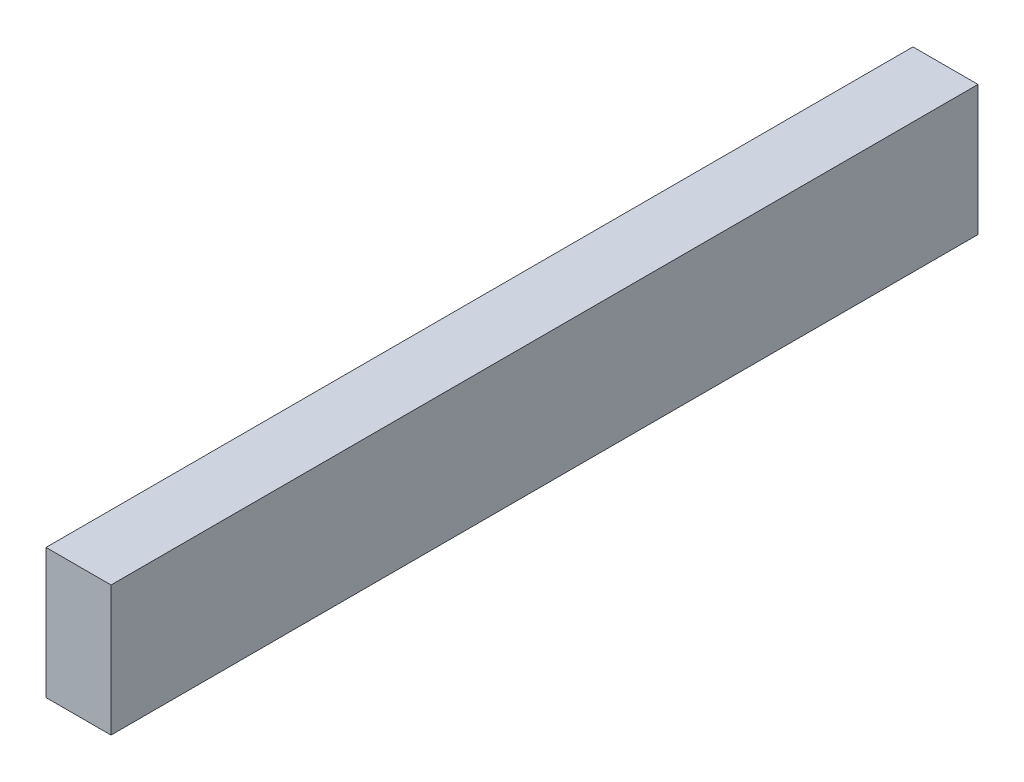
ISO-10303-21;
HEADER;
FILE_DESCRIPTION(('STEP AP214'),'2;1');
FILE_NAME('part.step','',(''),(''),'','','');
FILE_SCHEMA(('AUTOMOTIVE_DESIGN { 1 0 10303 214 1 1 1 1 }'));
ENDSEC;
DATA;
#1=APPLICATION_CONTEXT('core data for automotive mechanical design processes');
#2=APPLICATION_PROTOCOL_DEFINITION('international standard','automotive_design',2000,#1);
#3=PRODUCT_CONTEXT('',#1,'mechanical');
#4=PRODUCT('Part','Part','',(#3));
#5=PRODUCT_RELATED_PRODUCT_CATEGORY('part','',(#4));
#6=PRODUCT_DEFINITION_FORMATION('','',#4);
#7=PRODUCT_DEFINITION_CONTEXT('part definition',#1,'design');
#8=PRODUCT_DEFINITION('design','',#6,#7);
#9=PRODUCT_DEFINITION_SHAPE('','',#8);
#10=(LENGTH_UNIT() NAMED_UNIT(*) SI_UNIT(.MILLI.,.METRE.));
#11=(NAMED_UNIT(*) PLANE_ANGLE_UNIT() SI_UNIT($,.RADIAN.));
#12=(NAMED_UNIT(*) SI_UNIT($,.STERADIAN.) SOLID_ANGLE_UNIT());
#13=UNCERTAINTY_MEASURE_WITH_UNIT(LENGTH_MEASURE(1.E-05),#10,'distance_accuracy_value','');
#14=(GEOMETRIC_REPRESENTATION_CONTEXT(3) GLOBAL_UNCERTAINTY_ASSIGNED_CONTEXT((#13)) GLOBAL_UNIT_ASSIGNED_CONTEXT((#10,
#11,#12)) REPRESENTATION_CONTEXT('',''));
#15=CARTESIAN_POINT('',(0.,0.,0.));
#16=DIRECTION('',(0.,0.,1.));
#17=DIRECTION('',(1.,0.,0.));
#18=AXIS2_PLACEMENT_3D('',#15,#16,#17);
#19=CARTESIAN_POINT('',(-15.,15.,-400.));
#20=DIRECTION('',(-1.,0.,0.));
#21=DIRECTION('',(0.,0.,1.));
#22=AXIS2_PLACEMENT_3D('',#19,#20,#21);
#23=PLANE('',#22);
#24=DIRECTION('',(0.,-1.,0.));
#25=VECTOR('',#24,1.);
#26=CARTESIAN_POINT('',(-15.,15.,0.));
#27=LINE('',#26,#25);
#28=CARTESIAN_POINT('',(-15.,45.,0.));
#29=VERTEX_POINT('',#28);
#30=CARTESIAN_POINT('',(-15.,-15.,0.));
#31=VERTEX_POINT('',#30);
#32=EDGE_CURVE('E79',#29,#31,#27,.T.);
#33=ORIENTED_EDGE('',*,*,#32,.F.);
#34=DIRECTION('',(0.,0.,1.));
#35=VECTOR('',#34,1.);
#36=CARTESIAN_POINT('',(-15.,45.,-400.));
#37=LINE('',#36,#35);
#38=CARTESIAN_POINT('',(-15.,45.,-400.));
#39=VERTEX_POINT('',#38);
#40=EDGE_CURVE('E82',#39,#29,#37,.T.);
#41=ORIENTED_EDGE('',*,*,#40,.F.);
#42=DIRECTION('',(0.,-1.,0.));
#43=VECTOR('',#42,1.);
#44=CARTESIAN_POINT('',(-15.,15.,-400.));
#45=LINE('',#44,#43);
#46=CARTESIAN_POINT('',(-15.,-15.,-400.));
#47=VERTEX_POINT('',#46);
#48=EDGE_CURVE('E70',#39,#47,#45,.T.);
#49=ORIENTED_EDGE('',*,*,#48,.T.);
#50=DIRECTION('',(0.,0.,1.));
#51=VECTOR('',#50,1.);
#52=CARTESIAN_POINT('',(-15.,-15.,-400.));
#53=LINE('',#52,#51);
#54=EDGE_CURVE('E41',#47,#31,#53,.T.);
#55=ORIENTED_EDGE('',*,*,#54,.T.);
#56=EDGE_LOOP('',(#33,#41,#49,#55));
#57=FACE_BOUND('',#56,.T.);
#58=ADVANCED_FACE('F38',(#57),#23,.T.);
#59=CARTESIAN_POINT('',(15.,15.,-400.));
#60=DIRECTION('',(1.,0.,0.));
#61=DIRECTION('',(0.,1.,0.));
#62=AXIS2_PLACEMENT_3D('',#59,#60,#61);
#63=PLANE('',#62);
#64=DIRECTION('',(0.,1.,0.));
#65=VECTOR('',#64,1.);
#66=CARTESIAN_POINT('',(15.,15.,0.));
#67=LINE('',#66,#65);
#68=CARTESIAN_POINT('',(15.,-15.,0.));
#69=VERTEX_POINT('',#68);
#70=CARTESIAN_POINT('',(15.,45.,0.));
#71=VERTEX_POINT('',#70);
#72=EDGE_CURVE('E90',#69,#71,#67,.T.);
#73=ORIENTED_EDGE('',*,*,#72,.F.);
#74=DIRECTION('',(0.,0.,1.));
#75=VECTOR('',#74,1.);
#76=CARTESIAN_POINT('',(15.,-15.,-400.));
#77=LINE('',#76,#75);
#78=CARTESIAN_POINT('',(15.,-15.,-400.));
#79=VERTEX_POINT('',#78);
#80=EDGE_CURVE('E11',#79,#69,#77,.T.);
#81=ORIENTED_EDGE('',*,*,#80,.F.);
#82=DIRECTION('',(0.,1.,0.));
#83=VECTOR('',#82,1.);
#84=CARTESIAN_POINT('',(15.,15.,-400.));
#85=LINE('',#84,#83);
#86=CARTESIAN_POINT('',(15.,45.,-400.));
#87=VERTEX_POINT('',#86);
#88=EDGE_CURVE('E106',#79,#87,#85,.T.);
#89=ORIENTED_EDGE('',*,*,#88,.T.);
#90=DIRECTION('',(0.,0.,1.));
#91=VECTOR('',#90,1.);
#92=CARTESIAN_POINT('',(15.,45.,-400.));
#93=LINE('',#92,#91);
#94=EDGE_CURVE('E97',#87,#71,#93,.T.);
#95=ORIENTED_EDGE('',*,*,#94,.T.);
#96=EDGE_LOOP('',(#73,#81,#89,#95));
#97=FACE_BOUND('',#96,.T.);
#98=ADVANCED_FACE('F111',(#97),#63,.T.);
#99=CARTESIAN_POINT('',(15.,-15.,-400.));
#100=DIRECTION('',(0.,-1.,0.));
#101=DIRECTION('',(0.,0.,-1.));
#102=AXIS2_PLACEMENT_3D('',#99,#100,#101);
#103=PLANE('',#102);
#104=DIRECTION('',(1.,0.,0.));
#105=VECTOR('',#104,1.);
#106=CARTESIAN_POINT('',(15.,-15.,0.));
#107=LINE('',#106,#105);
#108=EDGE_CURVE('E85',#31,#69,#107,.T.);
#109=ORIENTED_EDGE('',*,*,#108,.F.);
#110=ORIENTED_EDGE('',*,*,#54,.F.);
#111=DIRECTION('',(1.,0.,0.));
#112=VECTOR('',#111,1.);
#113=CARTESIAN_POINT('',(15.,-15.,-400.));
#114=LINE('',#113,#112);
#115=EDGE_CURVE('E103',#47,#79,#114,.T.);
#116=ORIENTED_EDGE('',*,*,#115,.T.);
#117=ORIENTED_EDGE('',*,*,#80,.T.);
#118=EDGE_LOOP('',(#109,#110,#116,#117));
#119=FACE_BOUND('',#118,.T.);
#120=ADVANCED_FACE('F110',(#119),#103,.T.);
#121=CARTESIAN_POINT('',(0.,0.,-400.));
#122=DIRECTION('',(0.,0.,-1.));
#123=DIRECTION('',(-1.,0.,0.));
#124=AXIS2_PLACEMENT_3D('',#121,#122,#123);
#125=PLANE('',#124);
#126=ORIENTED_EDGE('',*,*,#48,.F.);
#127=DIRECTION('',(1.,0.,0.));
#128=VECTOR('',#127,1.);
#129=CARTESIAN_POINT('',(15.,45.,-400.));
#130=LINE('',#129,#128);
#131=EDGE_CURVE('E94',#39,#87,#130,.T.);
#132=ORIENTED_EDGE('',*,*,#131,.T.);
#133=ORIENTED_EDGE('',*,*,#88,.F.);
#134=ORIENTED_EDGE('',*,*,#115,.F.);
#135=EDGE_LOOP('',(#126,#132,#133,#134));
#136=FACE_BOUND('',#135,.T.);
#137=ADVANCED_FACE('F112',(#136),#125,.T.);
#138=CARTESIAN_POINT('',(0.,0.,0.));
#139=DIRECTION('',(0.,0.,-1.));
#140=DIRECTION('',(-1.,0.,0.));
#141=AXIS2_PLACEMENT_3D('',#138,#139,#140);
#142=PLANE('',#141);
#143=ORIENTED_EDGE('',*,*,#32,.T.);
#144=ORIENTED_EDGE('',*,*,#108,.T.);
#145=ORIENTED_EDGE('',*,*,#72,.T.);
#146=DIRECTION('',(1.,0.,0.));
#147=VECTOR('',#146,1.);
#148=CARTESIAN_POINT('',(15.,45.,0.));
#149=LINE('',#148,#147);
#150=EDGE_CURVE('E88',#29,#71,#149,.T.);
#151=ORIENTED_EDGE('',*,*,#150,.F.);
#152=EDGE_LOOP('',(#143,#144,#145,#151));
#153=FACE_BOUND('',#152,.T.);
#154=ADVANCED_FACE('F89',(#153),#142,.F.);
#155=CARTESIAN_POINT('',(15.,45.,-400.));
#156=DIRECTION('',(0.,-1.,0.));
#157=DIRECTION('',(0.,0.,-1.));
#158=AXIS2_PLACEMENT_3D('',#155,#156,#157);
#159=PLANE('',#158);
#160=ORIENTED_EDGE('',*,*,#150,.T.);
#161=ORIENTED_EDGE('',*,*,#94,.F.);
#162=ORIENTED_EDGE('',*,*,#131,.F.);
#163=ORIENTED_EDGE('',*,*,#40,.T.);
#164=EDGE_LOOP('',(#160,#161,#162,#163));
#165=FACE_BOUND('',#164,.T.);
#166=ADVANCED_FACE('F96',(#165),#159,.F.);
#167=CLOSED_SHELL('',(#58,#98,#120,#137,#154,#166));
#168=MANIFOLD_SOLID_BREP('B2',#167);
#169=ADVANCED_BREP_SHAPE_REPRESENTATION('',(#18,#168),#14);
#170=SHAPE_DEFINITION_REPRESENTATION(#9,#169);
ENDSEC;
END-ISO-10303-21;
